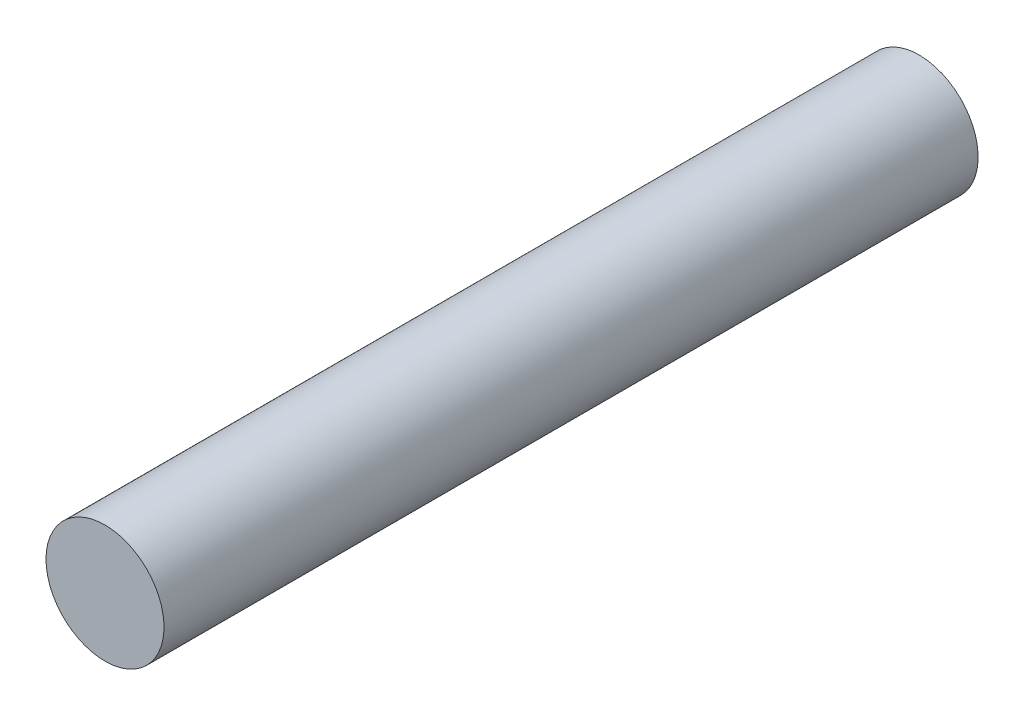
ISO-10303-21;
HEADER;
FILE_DESCRIPTION(('STEP AP214'),'2;1');
FILE_NAME('part.step','',(''),(''),'','','');
FILE_SCHEMA(('AUTOMOTIVE_DESIGN { 1 0 10303 214 1 1 1 1 }'));
ENDSEC;
DATA;
#1=APPLICATION_CONTEXT('core data for automotive mechanical design processes');
#2=APPLICATION_PROTOCOL_DEFINITION('international standard','automotive_design',2000,#1);
#3=PRODUCT_CONTEXT('',#1,'mechanical');
#4=PRODUCT('Part','Part','',(#3));
#5=PRODUCT_RELATED_PRODUCT_CATEGORY('part','',(#4));
#6=PRODUCT_DEFINITION_FORMATION('','',#4);
#7=PRODUCT_DEFINITION_CONTEXT('part definition',#1,'design');
#8=PRODUCT_DEFINITION('design','',#6,#7);
#9=PRODUCT_DEFINITION_SHAPE('','',#8);
#10=(LENGTH_UNIT() NAMED_UNIT(*) SI_UNIT(.MILLI.,.METRE.));
#11=(NAMED_UNIT(*) PLANE_ANGLE_UNIT() SI_UNIT($,.RADIAN.));
#12=(NAMED_UNIT(*) SI_UNIT($,.STERADIAN.) SOLID_ANGLE_UNIT());
#13=UNCERTAINTY_MEASURE_WITH_UNIT(LENGTH_MEASURE(1.E-05),#10,'distance_accuracy_value','');
#14=(GEOMETRIC_REPRESENTATION_CONTEXT(3) GLOBAL_UNCERTAINTY_ASSIGNED_CONTEXT((#13)) GLOBAL_UNIT_ASSIGNED_CONTEXT((#10,
#11,#12)) REPRESENTATION_CONTEXT('',''));
#15=CARTESIAN_POINT('',(0.,0.,0.));
#16=DIRECTION('',(0.,0.,1.));
#17=DIRECTION('',(1.,0.,0.));
#18=AXIS2_PLACEMENT_3D('',#15,#16,#17);
#19=CARTESIAN_POINT('',(0.,0.,55.2));
#20=DIRECTION('',(0.,0.,-1.));
#21=DIRECTION('',(-1.,0.,0.));
#22=AXIS2_PLACEMENT_3D('',#19,#20,#21);
#23=CYLINDRICAL_SURFACE('',#22,4.);
#24=CARTESIAN_POINT('',(0.,0.,55.2));
#25=DIRECTION('',(0.,0.,1.));
#26=DIRECTION('',(1.,0.,0.));
#27=AXIS2_PLACEMENT_3D('',#24,#25,#26);
#28=CIRCLE('',#27,4.);
#29=CARTESIAN_POINT('',(-4.,0.,55.2));
#30=VERTEX_POINT('',#29);
#31=EDGE_CURVE('E10',#30,#30,#28,.T.);
#32=CARTESIAN_POINT('',(0.,0.,0.));
#33=DIRECTION('',(0.,0.,1.));
#34=DIRECTION('',(1.,0.,0.));
#35=AXIS2_PLACEMENT_3D('',#32,#33,#34);
#36=CIRCLE('',#35,4.);
#37=CARTESIAN_POINT('',(-4.,0.,0.));
#38=VERTEX_POINT('',#37);
#39=EDGE_CURVE('E34',#38,#38,#36,.T.);
#40=CARTESIAN_POINT('',(-4.,0.,55.2));
#41=CARTESIAN_POINT('',(-4.,0.,54.625));
#42=CARTESIAN_POINT('',(-4.,0.,54.05));
#43=CARTESIAN_POINT('',(-4.,0.,52.9));
#44=CARTESIAN_POINT('',(-4.,0.,52.325));
#45=CARTESIAN_POINT('',(-4.,0.,51.175));
#46=CARTESIAN_POINT('',(-4.,0.,50.6));
#47=CARTESIAN_POINT('',(-4.,0.,49.45));
#48=CARTESIAN_POINT('',(-4.,0.,48.875));
#49=CARTESIAN_POINT('',(-4.,0.,47.725));
#50=CARTESIAN_POINT('',(-4.,0.,47.15));
#51=CARTESIAN_POINT('',(-4.,0.,46.));
#52=CARTESIAN_POINT('',(-4.,0.,45.425));
#53=CARTESIAN_POINT('',(-4.,0.,44.275));
#54=CARTESIAN_POINT('',(-4.,0.,43.7));
#55=CARTESIAN_POINT('',(-4.,0.,42.55));
#56=CARTESIAN_POINT('',(-4.,0.,41.975));
#57=CARTESIAN_POINT('',(-4.,0.,40.825));
#58=CARTESIAN_POINT('',(-4.,0.,40.25));
#59=CARTESIAN_POINT('',(-4.,0.,39.1));
#60=CARTESIAN_POINT('',(-4.,0.,38.525));
#61=CARTESIAN_POINT('',(-4.,0.,37.375));
#62=CARTESIAN_POINT('',(-4.,0.,36.8));
#63=CARTESIAN_POINT('',(-4.,0.,35.65));
#64=CARTESIAN_POINT('',(-4.,0.,35.075));
#65=CARTESIAN_POINT('',(-4.,0.,33.925));
#66=CARTESIAN_POINT('',(-4.,0.,33.35));
#67=CARTESIAN_POINT('',(-4.,0.,32.2));
#68=CARTESIAN_POINT('',(-4.,0.,31.625));
#69=CARTESIAN_POINT('',(-4.,0.,30.475));
#70=CARTESIAN_POINT('',(-4.,0.,29.9));
#71=CARTESIAN_POINT('',(-4.,0.,28.75));
#72=CARTESIAN_POINT('',(-4.,0.,28.175));
#73=CARTESIAN_POINT('',(-4.,0.,27.025));
#74=CARTESIAN_POINT('',(-4.,0.,26.45));
#75=CARTESIAN_POINT('',(-4.,0.,25.3));
#76=CARTESIAN_POINT('',(-4.,0.,24.725));
#77=CARTESIAN_POINT('',(-4.,0.,23.575));
#78=CARTESIAN_POINT('',(-4.,0.,23.));
#79=CARTESIAN_POINT('',(-4.,0.,21.85));
#80=CARTESIAN_POINT('',(-4.,0.,21.275));
#81=CARTESIAN_POINT('',(-4.,0.,20.125));
#82=CARTESIAN_POINT('',(-4.,0.,19.55));
#83=CARTESIAN_POINT('',(-4.,0.,18.4));
#84=CARTESIAN_POINT('',(-4.,0.,17.825));
#85=CARTESIAN_POINT('',(-4.,0.,16.675));
#86=CARTESIAN_POINT('',(-4.,0.,16.1));
#87=CARTESIAN_POINT('',(-4.,0.,14.95));
#88=CARTESIAN_POINT('',(-4.,0.,14.375));
#89=CARTESIAN_POINT('',(-4.,0.,13.225));
#90=CARTESIAN_POINT('',(-4.,0.,12.65));
#91=CARTESIAN_POINT('',(-4.,0.,11.5));
#92=CARTESIAN_POINT('',(-4.,0.,10.925));
#93=CARTESIAN_POINT('',(-4.,0.,9.775));
#94=CARTESIAN_POINT('',(-4.,0.,9.2));
#95=CARTESIAN_POINT('',(-4.,0.,8.05));
#96=CARTESIAN_POINT('',(-4.,0.,7.475));
#97=CARTESIAN_POINT('',(-4.,0.,6.325));
#98=CARTESIAN_POINT('',(-4.,0.,5.75));
#99=CARTESIAN_POINT('',(-4.,0.,4.6));
#100=CARTESIAN_POINT('',(-4.,0.,4.025));
#101=CARTESIAN_POINT('',(-4.,0.,2.875));
#102=CARTESIAN_POINT('',(-4.,0.,2.3));
#103=CARTESIAN_POINT('',(-4.,0.,1.15));
#104=CARTESIAN_POINT('',(-4.,0.,0.574999999999998));
#105=CARTESIAN_POINT('',(-4.,0.,0.));
#106=B_SPLINE_CURVE_WITH_KNOTS('',3,(#40,#41,#42,#43,#44,#45,#46,#47,#48,#49,#50,#51,#52,#53,
#54,#55,#56,#57,#58,#59,#60,#61,#62,#63,#64,#65,#66,#67,#68,#69,#70,#71,#72,#73,#74,#75,#76,#77,
#78,#79,#80,#81,#82,#83,#84,#85,#86,#87,#88,#89,#90,#91,#92,#93,#94,#95,#96,#97,#98,#99,#100,
#101,#102,#103,#104,#105),.UNSPECIFIED.,.F.,.F.,(4,2,2,2,2,2,2,2,2,2,2,2,2,2,2,2,2,2,2,2,2,2,2,
2,2,2,2,2,2,2,2,2,4),(0.,1.725,3.44999999999999,5.175,6.9,8.62499999999999,10.35,12.075,13.8,
15.525,17.25,18.975,20.7,22.425,24.15,25.875,27.6,29.325,31.05,32.775,34.5,36.225,37.95,39.675,
41.4,43.125,44.85,46.575,48.3,50.025,51.75,53.475,55.2),.UNSPECIFIED.);
#107=EDGE_CURVE('BSEAM31',#30,#38,#106,.T.);
#108=ORIENTED_EDGE('',*,*,#31,.F.);
#109=ORIENTED_EDGE('',*,*,#39,.T.);
#110=ORIENTED_EDGE('',*,*,#107,.T.);
#111=ORIENTED_EDGE('',*,*,#107,.F.);
#112=EDGE_LOOP('',(#108,#110,#109,#111));
#113=FACE_BOUND('',#112,.T.);
#114=ADVANCED_FACE('F31',(#113),#23,.T.);
#115=CARTESIAN_POINT('',(0.,0.,55.2));
#116=DIRECTION('',(0.,0.,1.));
#117=DIRECTION('',(1.,0.,0.));
#118=AXIS2_PLACEMENT_3D('',#115,#116,#117);
#119=PLANE('',#118);
#120=ORIENTED_EDGE('',*,*,#31,.T.);
#121=EDGE_LOOP('',(#120));
#122=FACE_BOUND('',#121,.T.);
#123=ADVANCED_FACE('F46',(#122),#119,.T.);
#124=CARTESIAN_POINT('',(0.,0.,0.));
#125=DIRECTION('',(0.,0.,1.));
#126=DIRECTION('',(1.,0.,0.));
#127=AXIS2_PLACEMENT_3D('',#124,#125,#126);
#128=PLANE('',#127);
#129=ORIENTED_EDGE('',*,*,#39,.F.);
#130=EDGE_LOOP('',(#129));
#131=FACE_BOUND('',#130,.T.);
#132=ADVANCED_FACE('F44',(#131),#128,.F.);
#133=CLOSED_SHELL('',(#114,#123,#132));
#134=MANIFOLD_SOLID_BREP('B2',#133);
#135=ADVANCED_BREP_SHAPE_REPRESENTATION('',(#18,#134),#14);
#136=SHAPE_DEFINITION_REPRESENTATION(#9,#135);
ENDSEC;
END-ISO-10303-21;
